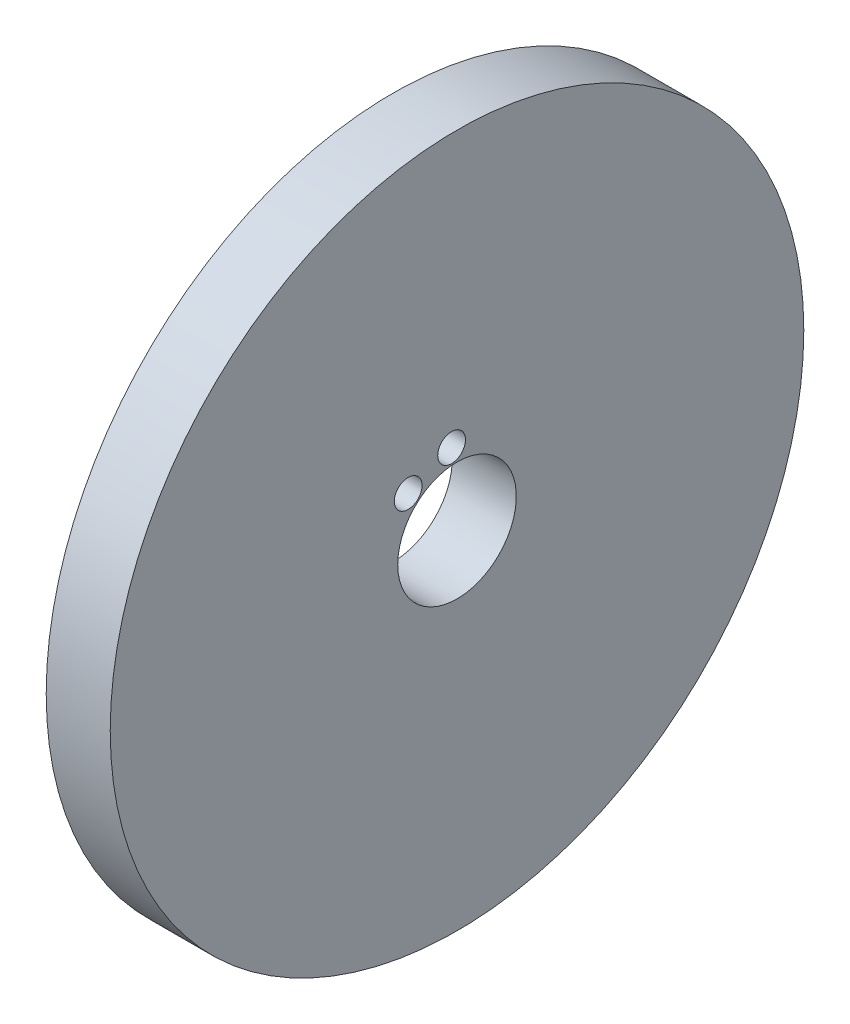
ISO-10303-21;
HEADER;
FILE_DESCRIPTION(('STEP AP214'),'2;1');
FILE_NAME('part.step','',(''),(''),'','','');
FILE_SCHEMA(('AUTOMOTIVE_DESIGN { 1 0 10303 214 1 1 1 1 }'));
ENDSEC;
DATA;
#1=APPLICATION_CONTEXT('core data for automotive mechanical design processes');
#2=APPLICATION_PROTOCOL_DEFINITION('international standard','automotive_design',2000,#1);
#3=PRODUCT_CONTEXT('',#1,'mechanical');
#4=PRODUCT('Part','Part','',(#3));
#5=PRODUCT_RELATED_PRODUCT_CATEGORY('part','',(#4));
#6=PRODUCT_DEFINITION_FORMATION('','',#4);
#7=PRODUCT_DEFINITION_CONTEXT('part definition',#1,'design');
#8=PRODUCT_DEFINITION('design','',#6,#7);
#9=PRODUCT_DEFINITION_SHAPE('','',#8);
#10=(LENGTH_UNIT() NAMED_UNIT(*) SI_UNIT(.MILLI.,.METRE.));
#11=(NAMED_UNIT(*) PLANE_ANGLE_UNIT() SI_UNIT($,.RADIAN.));
#12=(NAMED_UNIT(*) SI_UNIT($,.STERADIAN.) SOLID_ANGLE_UNIT());
#13=UNCERTAINTY_MEASURE_WITH_UNIT(LENGTH_MEASURE(1.E-05),#10,'distance_accuracy_value','');
#14=(GEOMETRIC_REPRESENTATION_CONTEXT(3) GLOBAL_UNCERTAINTY_ASSIGNED_CONTEXT((#13)) GLOBAL_UNIT_ASSIGNED_CONTEXT((#10,
#11,#12)) REPRESENTATION_CONTEXT('',''));
#15=CARTESIAN_POINT('',(0.,0.,0.));
#16=DIRECTION('',(0.,0.,1.));
#17=DIRECTION('',(1.,0.,0.));
#18=AXIS2_PLACEMENT_3D('',#15,#16,#17);
#19=CARTESIAN_POINT('',(13.7,65.,0.));
#20=DIRECTION('',(1.,0.,0.));
#21=DIRECTION('',(0.,0.,-1.));
#22=AXIS2_PLACEMENT_3D('',#19,#20,#21);
#23=PLANE('',#22);
#24=CARTESIAN_POINT('',(13.7,13.9630201959503,1.01689085328036));
#25=DIRECTION('',(1.,0.,0.));
#26=DIRECTION('',(0.,0.,-1.));
#27=AXIS2_PLACEMENT_3D('',#24,#25,#26);
#28=CIRCLE('',#27,2.6);
#29=CARTESIAN_POINT('',(13.7,13.9630201959503,3.61689085328036));
#30=VERTEX_POINT('',#29);
#31=EDGE_CURVE('E50',#30,#30,#28,.F.);
#32=ORIENTED_EDGE('',*,*,#31,.F.);
#33=EDGE_LOOP('',(#32));
#34=FACE_BOUND('',#33,.T.);
#35=CARTESIAN_POINT('',(13.7,10.5923966844823,9.15429584832002));
#36=DIRECTION('',(1.,0.,0.));
#37=DIRECTION('',(0.,0.,-1.));
#38=AXIS2_PLACEMENT_3D('',#35,#36,#37);
#39=CIRCLE('',#38,2.6);
#40=CARTESIAN_POINT('',(13.7,10.5923966844823,11.75429584832));
#41=VERTEX_POINT('',#40);
#42=EDGE_CURVE('E53',#41,#41,#39,.F.);
#43=ORIENTED_EDGE('',*,*,#42,.F.);
#44=EDGE_LOOP('',(#43));
#45=FACE_BOUND('',#44,.T.);
#46=CARTESIAN_POINT('',(13.7,0.,0.));
#47=DIRECTION('',(-1.,0.,0.));
#48=DIRECTION('',(0.,0.,1.));
#49=AXIS2_PLACEMENT_3D('',#46,#47,#48);
#50=CIRCLE('',#49,11.1125);
#51=CARTESIAN_POINT('',(13.7,0.,11.1125));
#52=VERTEX_POINT('',#51);
#53=EDGE_CURVE('E10',#52,#52,#50,.T.);
#54=ORIENTED_EDGE('',*,*,#53,.F.);
#55=EDGE_LOOP('',(#54));
#56=FACE_BOUND('',#55,.T.);
#57=CARTESIAN_POINT('',(13.7,0.,0.));
#58=DIRECTION('',(-1.,0.,0.));
#59=DIRECTION('',(0.,0.,1.));
#60=AXIS2_PLACEMENT_3D('',#57,#58,#59);
#61=CIRCLE('',#60,65.);
#62=CARTESIAN_POINT('',(13.7,0.,65.));
#63=VERTEX_POINT('',#62);
#64=EDGE_CURVE('E45',#63,#63,#61,.T.);
#65=ORIENTED_EDGE('',*,*,#64,.T.);
#66=EDGE_LOOP('',(#65));
#67=FACE_BOUND('',#66,.T.);
#68=ADVANCED_FACE('F31',(#34,#45,#56,#67),#23,.F.);
#69=CARTESIAN_POINT('',(-110.,0.,0.));
#70=DIRECTION('',(-1.,0.,0.));
#71=DIRECTION('',(0.,0.,1.));
#72=AXIS2_PLACEMENT_3D('',#69,#70,#71);
#73=CYLINDRICAL_SURFACE('',#72,11.1125);
#74=CARTESIAN_POINT('',(25.7,0.,0.));
#75=DIRECTION('',(-1.,0.,0.));
#76=DIRECTION('',(0.,0.,1.));
#77=AXIS2_PLACEMENT_3D('',#74,#75,#76);
#78=CIRCLE('',#77,11.1125);
#79=CARTESIAN_POINT('',(25.7,0.,11.1125));
#80=VERTEX_POINT('',#79);
#81=EDGE_CURVE('E37',#80,#80,#78,.T.);
#82=ORIENTED_EDGE('',*,*,#81,.F.);
#83=EDGE_LOOP('',(#82));
#84=FACE_BOUND('',#83,.T.);
#85=ORIENTED_EDGE('',*,*,#53,.T.);
#86=EDGE_LOOP('',(#85));
#87=FACE_BOUND('',#86,.T.);
#88=ADVANCED_FACE('F70',(#84,#87),#73,.F.);
#89=CARTESIAN_POINT('',(25.7,11.1125,0.));
#90=DIRECTION('',(-1.,0.,0.));
#91=DIRECTION('',(0.,0.,1.));
#92=AXIS2_PLACEMENT_3D('',#89,#90,#91);
#93=PLANE('',#92);
#94=CARTESIAN_POINT('',(25.7,13.9630201959503,1.01689085328036));
#95=DIRECTION('',(1.,0.,0.));
#96=DIRECTION('',(0.,0.,-1.));
#97=AXIS2_PLACEMENT_3D('',#94,#95,#96);
#98=CIRCLE('',#97,2.6);
#99=CARTESIAN_POINT('',(25.7,13.9630201959503,3.61689085328036));
#100=VERTEX_POINT('',#99);
#101=EDGE_CURVE('E56',#100,#100,#98,.T.);
#102=ORIENTED_EDGE('',*,*,#101,.F.);
#103=EDGE_LOOP('',(#102));
#104=FACE_BOUND('',#103,.T.);
#105=CARTESIAN_POINT('',(25.7,10.5923966844823,9.15429584832002));
#106=DIRECTION('',(1.,0.,0.));
#107=DIRECTION('',(0.,0.,-1.));
#108=AXIS2_PLACEMENT_3D('',#105,#106,#107);
#109=CIRCLE('',#108,2.6);
#110=CARTESIAN_POINT('',(25.7,10.5923966844823,11.75429584832));
#111=VERTEX_POINT('',#110);
#112=EDGE_CURVE('E57',#111,#111,#109,.T.);
#113=ORIENTED_EDGE('',*,*,#112,.F.);
#114=EDGE_LOOP('',(#113));
#115=FACE_BOUND('',#114,.T.);
#116=CARTESIAN_POINT('',(25.7,0.,0.));
#117=DIRECTION('',(-1.,0.,0.));
#118=DIRECTION('',(0.,0.,1.));
#119=AXIS2_PLACEMENT_3D('',#116,#117,#118);
#120=CIRCLE('',#119,65.);
#121=CARTESIAN_POINT('',(25.7,0.,65.));
#122=VERTEX_POINT('',#121);
#123=EDGE_CURVE('E41',#122,#122,#120,.T.);
#124=ORIENTED_EDGE('',*,*,#123,.F.);
#125=EDGE_LOOP('',(#124));
#126=FACE_BOUND('',#125,.T.);
#127=ORIENTED_EDGE('',*,*,#81,.T.);
#128=EDGE_LOOP('',(#127));
#129=FACE_BOUND('',#128,.T.);
#130=ADVANCED_FACE('F66',(#104,#115,#126,#129),#93,.F.);
#131=CARTESIAN_POINT('',(-110.,0.,0.));
#132=DIRECTION('',(-1.,0.,0.));
#133=DIRECTION('',(0.,0.,1.));
#134=AXIS2_PLACEMENT_3D('',#131,#132,#133);
#135=CYLINDRICAL_SURFACE('',#134,65.);
#136=ORIENTED_EDGE('',*,*,#64,.F.);
#137=EDGE_LOOP('',(#136));
#138=FACE_BOUND('',#137,.T.);
#139=ORIENTED_EDGE('',*,*,#123,.T.);
#140=EDGE_LOOP('',(#139));
#141=FACE_BOUND('',#140,.T.);
#142=ADVANCED_FACE('F69',(#138,#141),#135,.T.);
#143=CARTESIAN_POINT('',(13.7,10.5923966844823,9.15429584832002));
#144=DIRECTION('',(-1.,0.,0.));
#145=DIRECTION('',(0.,0.,1.));
#146=AXIS2_PLACEMENT_3D('',#143,#144,#145);
#147=CYLINDRICAL_SURFACE('',#146,2.6);
#148=CARTESIAN_POINT('',(25.7,10.5923966844823,11.75429584832));
#149=CARTESIAN_POINT('',(25.575,10.5923966844823,11.75429584832));
#150=CARTESIAN_POINT('',(25.45,10.5923966844823,11.75429584832));
#151=CARTESIAN_POINT('',(25.2,10.5923966844823,11.75429584832));
#152=CARTESIAN_POINT('',(25.075,10.5923966844823,11.75429584832));
#153=CARTESIAN_POINT('',(24.825,10.5923966844823,11.75429584832));
#154=CARTESIAN_POINT('',(24.7,10.5923966844823,11.75429584832));
#155=CARTESIAN_POINT('',(24.45,10.5923966844823,11.75429584832));
#156=CARTESIAN_POINT('',(24.325,10.5923966844823,11.75429584832));
#157=CARTESIAN_POINT('',(24.075,10.5923966844823,11.75429584832));
#158=CARTESIAN_POINT('',(23.95,10.5923966844823,11.75429584832));
#159=CARTESIAN_POINT('',(23.7,10.5923966844823,11.75429584832));
#160=CARTESIAN_POINT('',(23.575,10.5923966844823,11.75429584832));
#161=CARTESIAN_POINT('',(23.325,10.5923966844823,11.75429584832));
#162=CARTESIAN_POINT('',(23.2,10.5923966844823,11.75429584832));
#163=CARTESIAN_POINT('',(22.95,10.5923966844823,11.75429584832));
#164=CARTESIAN_POINT('',(22.825,10.5923966844823,11.75429584832));
#165=CARTESIAN_POINT('',(22.575,10.5923966844823,11.75429584832));
#166=CARTESIAN_POINT('',(22.45,10.5923966844823,11.75429584832));
#167=CARTESIAN_POINT('',(22.2,10.5923966844823,11.75429584832));
#168=CARTESIAN_POINT('',(22.075,10.5923966844823,11.75429584832));
#169=CARTESIAN_POINT('',(21.825,10.5923966844823,11.75429584832));
#170=CARTESIAN_POINT('',(21.7,10.5923966844823,11.75429584832));
#171=CARTESIAN_POINT('',(21.45,10.5923966844823,11.75429584832));
#172=CARTESIAN_POINT('',(21.325,10.5923966844823,11.75429584832));
#173=CARTESIAN_POINT('',(21.075,10.5923966844823,11.75429584832));
#174=CARTESIAN_POINT('',(20.95,10.5923966844823,11.75429584832));
#175=CARTESIAN_POINT('',(20.7,10.5923966844823,11.75429584832));
#176=CARTESIAN_POINT('',(20.575,10.5923966844823,11.75429584832));
#177=CARTESIAN_POINT('',(20.325,10.5923966844823,11.75429584832));
#178=CARTESIAN_POINT('',(20.2,10.5923966844823,11.75429584832));
#179=CARTESIAN_POINT('',(19.95,10.5923966844823,11.75429584832));
#180=CARTESIAN_POINT('',(19.825,10.5923966844823,11.75429584832));
#181=CARTESIAN_POINT('',(19.575,10.5923966844823,11.75429584832));
#182=CARTESIAN_POINT('',(19.45,10.5923966844823,11.75429584832));
#183=CARTESIAN_POINT('',(19.2,10.5923966844823,11.75429584832));
#184=CARTESIAN_POINT('',(19.075,10.5923966844823,11.75429584832));
#185=CARTESIAN_POINT('',(18.825,10.5923966844823,11.75429584832));
#186=CARTESIAN_POINT('',(18.7,10.5923966844823,11.75429584832));
#187=CARTESIAN_POINT('',(18.45,10.5923966844823,11.75429584832));
#188=CARTESIAN_POINT('',(18.325,10.5923966844823,11.75429584832));
#189=CARTESIAN_POINT('',(18.075,10.5923966844823,11.75429584832));
#190=CARTESIAN_POINT('',(17.95,10.5923966844823,11.75429584832));
#191=CARTESIAN_POINT('',(17.7,10.5923966844823,11.75429584832));
#192=CARTESIAN_POINT('',(17.575,10.5923966844823,11.75429584832));
#193=CARTESIAN_POINT('',(17.325,10.5923966844823,11.75429584832));
#194=CARTESIAN_POINT('',(17.2,10.5923966844823,11.75429584832));
#195=CARTESIAN_POINT('',(16.95,10.5923966844823,11.75429584832));
#196=CARTESIAN_POINT('',(16.825,10.5923966844823,11.75429584832));
#197=CARTESIAN_POINT('',(16.575,10.5923966844823,11.75429584832));
#198=CARTESIAN_POINT('',(16.45,10.5923966844823,11.75429584832));
#199=CARTESIAN_POINT('',(16.2,10.5923966844823,11.75429584832));
#200=CARTESIAN_POINT('',(16.075,10.5923966844823,11.75429584832));
#201=CARTESIAN_POINT('',(15.825,10.5923966844823,11.75429584832));
#202=CARTESIAN_POINT('',(15.7,10.5923966844823,11.75429584832));
#203=CARTESIAN_POINT('',(15.45,10.5923966844823,11.75429584832));
#204=CARTESIAN_POINT('',(15.325,10.5923966844823,11.75429584832));
#205=CARTESIAN_POINT('',(15.075,10.5923966844823,11.75429584832));
#206=CARTESIAN_POINT('',(14.95,10.5923966844823,11.75429584832));
#207=CARTESIAN_POINT('',(14.7,10.5923966844823,11.75429584832));
#208=CARTESIAN_POINT('',(14.575,10.5923966844823,11.75429584832));
#209=CARTESIAN_POINT('',(14.325,10.5923966844823,11.75429584832));
#210=CARTESIAN_POINT('',(14.2,10.5923966844823,11.75429584832));
#211=CARTESIAN_POINT('',(13.95,10.5923966844823,11.75429584832));
#212=CARTESIAN_POINT('',(13.825,10.5923966844823,11.75429584832));
#213=CARTESIAN_POINT('',(13.7,10.5923966844823,11.75429584832));
#214=B_SPLINE_CURVE_WITH_KNOTS('',3,(#148,#149,#150,#151,#152,#153,#154,#155,#156,#157,#158,
#159,#160,#161,#162,#163,#164,#165,#166,#167,#168,#169,#170,#171,#172,#173,#174,#175,#176,#177,
#178,#179,#180,#181,#182,#183,#184,#185,#186,#187,#188,#189,#190,#191,#192,#193,#194,#195,#196,
#197,#198,#199,#200,#201,#202,#203,#204,#205,#206,#207,#208,#209,#210,#211,#212,#213),
.UNSPECIFIED.,.F.,.F.,(4,2,2,2,2,2,2,2,2,2,2,2,2,2,2,2,2,2,2,2,2,2,2,2,2,2,2,2,2,2,2,2,4),(0.,
0.375,0.750000000000001,1.125,1.5,1.875,2.25,2.625,3.,3.375,3.75,4.125,4.5,4.875,5.25,
5.62499999999999,5.99999999999999,6.375,6.74999999999999,7.12499999999999,7.49999999999999,
7.87499999999999,8.24999999999999,8.62499999999999,8.99999999999999,9.37499999999999,
9.74999999999999,10.125,10.5,10.875,11.25,11.625,12.),.UNSPECIFIED.);
#215=EDGE_CURVE('BSEAM77',#111,#41,#214,.T.);
#216=ORIENTED_EDGE('',*,*,#112,.T.);
#217=ORIENTED_EDGE('',*,*,#42,.T.);
#218=ORIENTED_EDGE('',*,*,#215,.T.);
#219=ORIENTED_EDGE('',*,*,#215,.F.);
#220=EDGE_LOOP('',(#216,#218,#217,#219));
#221=FACE_BOUND('',#220,.T.);
#222=ADVANCED_FACE('F77',(#221),#147,.F.);
#223=CARTESIAN_POINT('',(13.7,13.9630201959503,1.01689085328036));
#224=DIRECTION('',(-1.,0.,0.));
#225=DIRECTION('',(0.,0.,1.));
#226=AXIS2_PLACEMENT_3D('',#223,#224,#225);
#227=CYLINDRICAL_SURFACE('',#226,2.6);
#228=CARTESIAN_POINT('',(25.7,13.9630201959503,3.61689085328036));
#229=CARTESIAN_POINT('',(25.575,13.9630201959503,3.61689085328036));
#230=CARTESIAN_POINT('',(25.45,13.9630201959503,3.61689085328036));
#231=CARTESIAN_POINT('',(25.2,13.9630201959503,3.61689085328036));
#232=CARTESIAN_POINT('',(25.075,13.9630201959503,3.61689085328036));
#233=CARTESIAN_POINT('',(24.825,13.9630201959503,3.61689085328036));
#234=CARTESIAN_POINT('',(24.7,13.9630201959503,3.61689085328036));
#235=CARTESIAN_POINT('',(24.45,13.9630201959503,3.61689085328036));
#236=CARTESIAN_POINT('',(24.325,13.9630201959503,3.61689085328036));
#237=CARTESIAN_POINT('',(24.075,13.9630201959503,3.61689085328036));
#238=CARTESIAN_POINT('',(23.95,13.9630201959503,3.61689085328036));
#239=CARTESIAN_POINT('',(23.7,13.9630201959503,3.61689085328036));
#240=CARTESIAN_POINT('',(23.575,13.9630201959503,3.61689085328036));
#241=CARTESIAN_POINT('',(23.325,13.9630201959503,3.61689085328036));
#242=CARTESIAN_POINT('',(23.2,13.9630201959503,3.61689085328036));
#243=CARTESIAN_POINT('',(22.95,13.9630201959503,3.61689085328036));
#244=CARTESIAN_POINT('',(22.825,13.9630201959503,3.61689085328036));
#245=CARTESIAN_POINT('',(22.575,13.9630201959503,3.61689085328036));
#246=CARTESIAN_POINT('',(22.45,13.9630201959503,3.61689085328036));
#247=CARTESIAN_POINT('',(22.2,13.9630201959503,3.61689085328036));
#248=CARTESIAN_POINT('',(22.075,13.9630201959503,3.61689085328036));
#249=CARTESIAN_POINT('',(21.825,13.9630201959503,3.61689085328036));
#250=CARTESIAN_POINT('',(21.7,13.9630201959503,3.61689085328036));
#251=CARTESIAN_POINT('',(21.45,13.9630201959503,3.61689085328036));
#252=CARTESIAN_POINT('',(21.325,13.9630201959503,3.61689085328036));
#253=CARTESIAN_POINT('',(21.075,13.9630201959503,3.61689085328036));
#254=CARTESIAN_POINT('',(20.95,13.9630201959503,3.61689085328036));
#255=CARTESIAN_POINT('',(20.7,13.9630201959503,3.61689085328036));
#256=CARTESIAN_POINT('',(20.575,13.9630201959503,3.61689085328036));
#257=CARTESIAN_POINT('',(20.325,13.9630201959503,3.61689085328036));
#258=CARTESIAN_POINT('',(20.2,13.9630201959503,3.61689085328036));
#259=CARTESIAN_POINT('',(19.95,13.9630201959503,3.61689085328036));
#260=CARTESIAN_POINT('',(19.825,13.9630201959503,3.61689085328036));
#261=CARTESIAN_POINT('',(19.575,13.9630201959503,3.61689085328036));
#262=CARTESIAN_POINT('',(19.45,13.9630201959503,3.61689085328036));
#263=CARTESIAN_POINT('',(19.2,13.9630201959503,3.61689085328036));
#264=CARTESIAN_POINT('',(19.075,13.9630201959503,3.61689085328036));
#265=CARTESIAN_POINT('',(18.825,13.9630201959503,3.61689085328036));
#266=CARTESIAN_POINT('',(18.7,13.9630201959503,3.61689085328036));
#267=CARTESIAN_POINT('',(18.45,13.9630201959503,3.61689085328036));
#268=CARTESIAN_POINT('',(18.325,13.9630201959503,3.61689085328036));
#269=CARTESIAN_POINT('',(18.075,13.9630201959503,3.61689085328036));
#270=CARTESIAN_POINT('',(17.95,13.9630201959503,3.61689085328036));
#271=CARTESIAN_POINT('',(17.7,13.9630201959503,3.61689085328036));
#272=CARTESIAN_POINT('',(17.575,13.9630201959503,3.61689085328036));
#273=CARTESIAN_POINT('',(17.325,13.9630201959503,3.61689085328036));
#274=CARTESIAN_POINT('',(17.2,13.9630201959503,3.61689085328036));
#275=CARTESIAN_POINT('',(16.95,13.9630201959503,3.61689085328036));
#276=CARTESIAN_POINT('',(16.825,13.9630201959503,3.61689085328036));
#277=CARTESIAN_POINT('',(16.575,13.9630201959503,3.61689085328036));
#278=CARTESIAN_POINT('',(16.45,13.9630201959503,3.61689085328036));
#279=CARTESIAN_POINT('',(16.2,13.9630201959503,3.61689085328036));
#280=CARTESIAN_POINT('',(16.075,13.9630201959503,3.61689085328036));
#281=CARTESIAN_POINT('',(15.825,13.9630201959503,3.61689085328036));
#282=CARTESIAN_POINT('',(15.7,13.9630201959503,3.61689085328036));
#283=CARTESIAN_POINT('',(15.45,13.9630201959503,3.61689085328036));
#284=CARTESIAN_POINT('',(15.325,13.9630201959503,3.61689085328036));
#285=CARTESIAN_POINT('',(15.075,13.9630201959503,3.61689085328036));
#286=CARTESIAN_POINT('',(14.95,13.9630201959503,3.61689085328036));
#287=CARTESIAN_POINT('',(14.7,13.9630201959503,3.61689085328036));
#288=CARTESIAN_POINT('',(14.575,13.9630201959503,3.61689085328036));
#289=CARTESIAN_POINT('',(14.325,13.9630201959503,3.61689085328036));
#290=CARTESIAN_POINT('',(14.2,13.9630201959503,3.61689085328036));
#291=CARTESIAN_POINT('',(13.95,13.9630201959503,3.61689085328036));
#292=CARTESIAN_POINT('',(13.825,13.9630201959503,3.61689085328036));
#293=CARTESIAN_POINT('',(13.7,13.9630201959503,3.61689085328036));
#294=B_SPLINE_CURVE_WITH_KNOTS('',3,(#228,#229,#230,#231,#232,#233,#234,#235,#236,#237,#238,
#239,#240,#241,#242,#243,#244,#245,#246,#247,#248,#249,#250,#251,#252,#253,#254,#255,#256,#257,
#258,#259,#260,#261,#262,#263,#264,#265,#266,#267,#268,#269,#270,#271,#272,#273,#274,#275,#276,
#277,#278,#279,#280,#281,#282,#283,#284,#285,#286,#287,#288,#289,#290,#291,#292,#293),
.UNSPECIFIED.,.F.,.F.,(4,2,2,2,2,2,2,2,2,2,2,2,2,2,2,2,2,2,2,2,2,2,2,2,2,2,2,2,2,2,2,2,4),(0.,
0.375,0.750000000000001,1.125,1.5,1.875,2.25,2.625,3.,3.375,3.75,4.125,4.5,4.875,5.25,
5.62499999999999,5.99999999999999,6.375,6.74999999999999,7.12499999999999,7.49999999999999,
7.87499999999999,8.24999999999999,8.62499999999999,8.99999999999999,9.37499999999999,
9.74999999999999,10.125,10.5,10.875,11.25,11.625,12.),.UNSPECIFIED.);
#295=EDGE_CURVE('BSEAM63',#100,#30,#294,.T.);
#296=ORIENTED_EDGE('',*,*,#101,.T.);
#297=ORIENTED_EDGE('',*,*,#31,.T.);
#298=ORIENTED_EDGE('',*,*,#295,.T.);
#299=ORIENTED_EDGE('',*,*,#295,.F.);
#300=EDGE_LOOP('',(#296,#298,#297,#299));
#301=FACE_BOUND('',#300,.T.);
#302=ADVANCED_FACE('F63',(#301),#227,.F.);
#303=CLOSED_SHELL('',(#68,#88,#130,#142,#222,#302));
#304=MANIFOLD_SOLID_BREP('B2',#303);
#305=ADVANCED_BREP_SHAPE_REPRESENTATION('',(#18,#304),#14);
#306=SHAPE_DEFINITION_REPRESENTATION(#9,#305);
ENDSEC;
END-ISO-10303-21;
